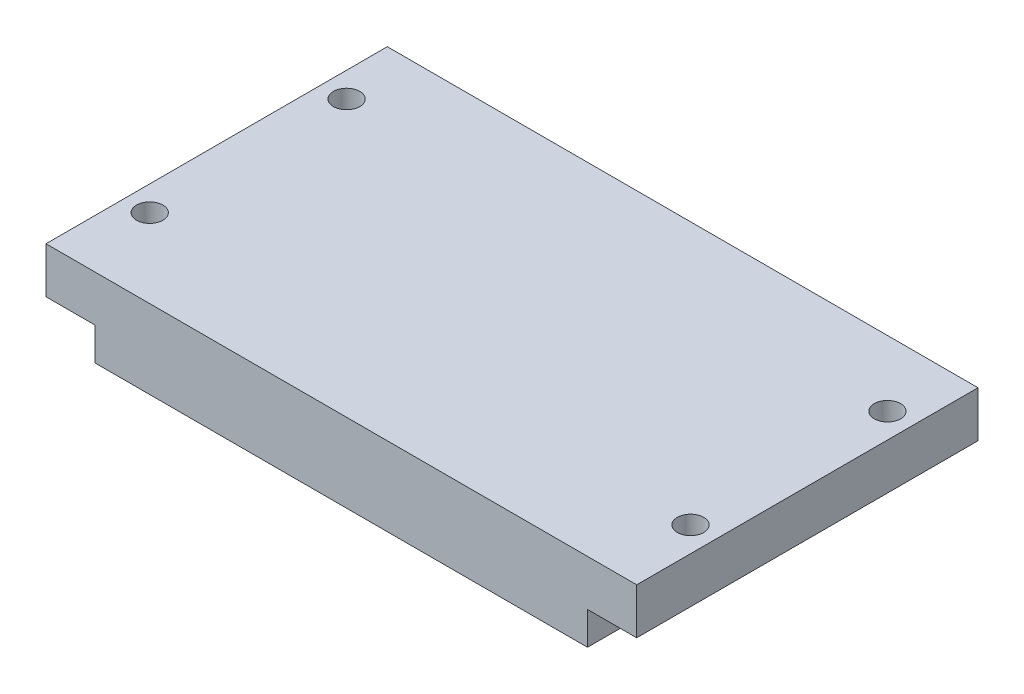
ISO-10303-21;
HEADER;
FILE_DESCRIPTION(('STEP AP214'),'2;1');
FILE_NAME('part.step','',(''),(''),'','','');
FILE_SCHEMA(('AUTOMOTIVE_DESIGN { 1 0 10303 214 1 1 1 1 }'));
ENDSEC;
DATA;
#1=APPLICATION_CONTEXT('core data for automotive mechanical design processes');
#2=APPLICATION_PROTOCOL_DEFINITION('international standard','automotive_design',2000,#1);
#3=PRODUCT_CONTEXT('',#1,'mechanical');
#4=PRODUCT('Part','Part','',(#3));
#5=PRODUCT_RELATED_PRODUCT_CATEGORY('part','',(#4));
#6=PRODUCT_DEFINITION_FORMATION('','',#4);
#7=PRODUCT_DEFINITION_CONTEXT('part definition',#1,'design');
#8=PRODUCT_DEFINITION('design','',#6,#7);
#9=PRODUCT_DEFINITION_SHAPE('','',#8);
#10=(LENGTH_UNIT() NAMED_UNIT(*) SI_UNIT(.MILLI.,.METRE.));
#11=(NAMED_UNIT(*) PLANE_ANGLE_UNIT() SI_UNIT($,.RADIAN.));
#12=(NAMED_UNIT(*) SI_UNIT($,.STERADIAN.) SOLID_ANGLE_UNIT());
#13=UNCERTAINTY_MEASURE_WITH_UNIT(LENGTH_MEASURE(1.E-05),#10,'distance_accuracy_value','');
#14=(GEOMETRIC_REPRESENTATION_CONTEXT(3) GLOBAL_UNCERTAINTY_ASSIGNED_CONTEXT((#13)) GLOBAL_UNIT_ASSIGNED_CONTEXT((#10,
#11,#12)) REPRESENTATION_CONTEXT('',''));
#15=CARTESIAN_POINT('',(0.,0.,0.));
#16=DIRECTION('',(0.,0.,1.));
#17=DIRECTION('',(1.,0.,0.));
#18=AXIS2_PLACEMENT_3D('',#15,#16,#17);
#19=CARTESIAN_POINT('',(0.,0.,66.04));
#20=DIRECTION('',(1.,0.,0.));
#21=DIRECTION('',(0.,1.,0.));
#22=AXIS2_PLACEMENT_3D('',#19,#20,#21);
#23=PLANE('',#22);
#24=DIRECTION('',(0.,-1.,0.));
#25=VECTOR('',#24,1.);
#26=CARTESIAN_POINT('',(0.,0.,0.));
#27=LINE('',#26,#25);
#28=CARTESIAN_POINT('',(0.,0.,0.));
#29=VERTEX_POINT('',#28);
#30=CARTESIAN_POINT('',(0.,-8.89,0.));
#31=VERTEX_POINT('',#30);
#32=EDGE_CURVE('E128',#29,#31,#27,.T.);
#33=ORIENTED_EDGE('',*,*,#32,.T.);
#34=DIRECTION('',(0.,0.,-1.));
#35=VECTOR('',#34,1.);
#36=CARTESIAN_POINT('',(0.,-8.89,66.04));
#37=LINE('',#36,#35);
#38=CARTESIAN_POINT('',(0.,-8.89,66.04));
#39=VERTEX_POINT('',#38);
#40=EDGE_CURVE('E11',#39,#31,#37,.T.);
#41=ORIENTED_EDGE('',*,*,#40,.F.);
#42=DIRECTION('',(0.,-1.,0.));
#43=VECTOR('',#42,1.);
#44=CARTESIAN_POINT('',(0.,0.,66.04));
#45=LINE('',#44,#43);
#46=CARTESIAN_POINT('',(0.,0.,66.04));
#47=VERTEX_POINT('',#46);
#48=EDGE_CURVE('E143',#47,#39,#45,.T.);
#49=ORIENTED_EDGE('',*,*,#48,.F.);
#50=DIRECTION('',(0.,0.,-1.));
#51=VECTOR('',#50,1.);
#52=CARTESIAN_POINT('',(0.,0.,66.04));
#53=LINE('',#52,#51);
#54=EDGE_CURVE('E124',#47,#29,#53,.T.);
#55=ORIENTED_EDGE('',*,*,#54,.T.);
#56=EDGE_LOOP('',(#33,#41,#49,#55));
#57=FACE_BOUND('',#56,.T.);
#58=ADVANCED_FACE('F32',(#57),#23,.F.);
#59=CARTESIAN_POINT('',(0.,-8.89,66.04));
#60=DIRECTION('',(0.,1.,0.));
#61=DIRECTION('',(0.,0.,1.));
#62=AXIS2_PLACEMENT_3D('',#59,#60,#61);
#63=PLANE('',#62);
#64=CARTESIAN_POINT('',(4.826,-8.89,12.7));
#65=DIRECTION('',(0.,1.,0.));
#66=DIRECTION('',(0.,0.,1.));
#67=AXIS2_PLACEMENT_3D('',#64,#65,#66);
#68=CIRCLE('',#67,2.55269999999999);
#69=CARTESIAN_POINT('',(4.826,-8.89,15.2527));
#70=VERTEX_POINT('',#69);
#71=EDGE_CURVE('E193',#70,#70,#68,.T.);
#72=ORIENTED_EDGE('',*,*,#71,.T.);
#73=EDGE_LOOP('',(#72));
#74=FACE_BOUND('',#73,.T.);
#75=CARTESIAN_POINT('',(4.826,-8.89,50.8));
#76=DIRECTION('',(0.,1.,0.));
#77=DIRECTION('',(0.,0.,1.));
#78=AXIS2_PLACEMENT_3D('',#75,#76,#77);
#79=CIRCLE('',#78,2.55269999999999);
#80=CARTESIAN_POINT('',(4.826,-8.89,53.3527));
#81=VERTEX_POINT('',#80);
#82=EDGE_CURVE('E187',#81,#81,#79,.T.);
#83=ORIENTED_EDGE('',*,*,#82,.T.);
#84=EDGE_LOOP('',(#83));
#85=FACE_BOUND('',#84,.T.);
#86=DIRECTION('',(1.,0.,0.));
#87=VECTOR('',#86,1.);
#88=CARTESIAN_POINT('',(0.,-8.89,0.));
#89=LINE('',#88,#87);
#90=CARTESIAN_POINT('',(9.525,-8.89,0.));
#91=VERTEX_POINT('',#90);
#92=EDGE_CURVE('E131',#31,#91,#89,.T.);
#93=ORIENTED_EDGE('',*,*,#92,.T.);
#94=DIRECTION('',(0.,0.,-1.));
#95=VECTOR('',#94,1.);
#96=CARTESIAN_POINT('',(9.525,-8.89,66.04));
#97=LINE('',#96,#95);
#98=CARTESIAN_POINT('',(9.525,-8.89,66.04));
#99=VERTEX_POINT('',#98);
#100=EDGE_CURVE('E40',#99,#91,#97,.T.);
#101=ORIENTED_EDGE('',*,*,#100,.F.);
#102=DIRECTION('',(1.,0.,0.));
#103=VECTOR('',#102,1.);
#104=CARTESIAN_POINT('',(0.,-8.89,66.04));
#105=LINE('',#104,#103);
#106=EDGE_CURVE('E91',#39,#99,#105,.T.);
#107=ORIENTED_EDGE('',*,*,#106,.F.);
#108=ORIENTED_EDGE('',*,*,#40,.T.);
#109=EDGE_LOOP('',(#93,#101,#107,#108));
#110=FACE_BOUND('',#109,.T.);
#111=ADVANCED_FACE('F230',(#74,#85,#110),#63,.F.);
#112=CARTESIAN_POINT('',(9.525,-8.89,66.04));
#113=DIRECTION('',(1.,0.,0.));
#114=DIRECTION('',(0.,0.,-1.));
#115=AXIS2_PLACEMENT_3D('',#112,#113,#114);
#116=PLANE('',#115);
#117=DIRECTION('',(0.,-1.,0.));
#118=VECTOR('',#117,1.);
#119=CARTESIAN_POINT('',(9.525,-8.89,0.));
#120=LINE('',#119,#118);
#121=CARTESIAN_POINT('',(9.525,-15.24,0.));
#122=VERTEX_POINT('',#121);
#123=EDGE_CURVE('E134',#91,#122,#120,.T.);
#124=ORIENTED_EDGE('',*,*,#123,.T.);
#125=DIRECTION('',(0.,0.,-1.));
#126=VECTOR('',#125,1.);
#127=CARTESIAN_POINT('',(9.525,-15.24,66.04));
#128=LINE('',#127,#126);
#129=CARTESIAN_POINT('',(9.525,-15.24,66.04));
#130=VERTEX_POINT('',#129);
#131=EDGE_CURVE('E150',#130,#122,#128,.T.);
#132=ORIENTED_EDGE('',*,*,#131,.F.);
#133=DIRECTION('',(0.,-1.,0.));
#134=VECTOR('',#133,1.);
#135=CARTESIAN_POINT('',(9.525,-8.89,66.04));
#136=LINE('',#135,#134);
#137=EDGE_CURVE('E158',#99,#130,#136,.T.);
#138=ORIENTED_EDGE('',*,*,#137,.F.);
#139=ORIENTED_EDGE('',*,*,#100,.T.);
#140=EDGE_LOOP('',(#124,#132,#138,#139));
#141=FACE_BOUND('',#140,.T.);
#142=ADVANCED_FACE('F156',(#141),#116,.F.);
#143=CARTESIAN_POINT('',(9.525,-15.24,66.04));
#144=DIRECTION('',(0.,1.,0.));
#145=DIRECTION('',(0.,0.,1.));
#146=AXIS2_PLACEMENT_3D('',#143,#144,#145);
#147=PLANE('',#146);
#148=DIRECTION('',(1.,0.,0.));
#149=VECTOR('',#148,1.);
#150=CARTESIAN_POINT('',(9.525,-15.24,0.));
#151=LINE('',#150,#149);
#152=CARTESIAN_POINT('',(104.775,-15.24,0.));
#153=VERTEX_POINT('',#152);
#154=EDGE_CURVE('E136',#122,#153,#151,.T.);
#155=ORIENTED_EDGE('',*,*,#154,.T.);
#156=DIRECTION('',(0.,0.,-1.));
#157=VECTOR('',#156,1.);
#158=CARTESIAN_POINT('',(104.775,-15.24,66.04));
#159=LINE('',#158,#157);
#160=CARTESIAN_POINT('',(104.775,-15.24,66.04));
#161=VERTEX_POINT('',#160);
#162=EDGE_CURVE('E147',#161,#153,#159,.T.);
#163=ORIENTED_EDGE('',*,*,#162,.F.);
#164=DIRECTION('',(1.,0.,0.));
#165=VECTOR('',#164,1.);
#166=CARTESIAN_POINT('',(9.525,-15.24,66.04));
#167=LINE('',#166,#165);
#168=EDGE_CURVE('E170',#130,#161,#167,.T.);
#169=ORIENTED_EDGE('',*,*,#168,.F.);
#170=ORIENTED_EDGE('',*,*,#131,.T.);
#171=EDGE_LOOP('',(#155,#163,#169,#170));
#172=FACE_BOUND('',#171,.T.);
#173=ADVANCED_FACE('F166',(#172),#147,.F.);
#174=CARTESIAN_POINT('',(104.775,-8.89,66.04));
#175=DIRECTION('',(-1.,0.,0.));
#176=DIRECTION('',(0.,0.,1.));
#177=AXIS2_PLACEMENT_3D('',#174,#175,#176);
#178=PLANE('',#177);
#179=DIRECTION('',(0.,1.,0.));
#180=VECTOR('',#179,1.);
#181=CARTESIAN_POINT('',(104.775,-8.89,0.));
#182=LINE('',#181,#180);
#183=CARTESIAN_POINT('',(104.775,-8.89,0.));
#184=VERTEX_POINT('',#183);
#185=EDGE_CURVE('E138',#153,#184,#182,.T.);
#186=ORIENTED_EDGE('',*,*,#185,.T.);
#187=DIRECTION('',(0.,0.,-1.));
#188=VECTOR('',#187,1.);
#189=CARTESIAN_POINT('',(104.775,-8.89,66.04));
#190=LINE('',#189,#188);
#191=CARTESIAN_POINT('',(104.775,-8.89,66.04));
#192=VERTEX_POINT('',#191);
#193=EDGE_CURVE('E119',#192,#184,#190,.T.);
#194=ORIENTED_EDGE('',*,*,#193,.F.);
#195=DIRECTION('',(0.,1.,0.));
#196=VECTOR('',#195,1.);
#197=CARTESIAN_POINT('',(104.775,-8.89,66.04));
#198=LINE('',#197,#196);
#199=EDGE_CURVE('E110',#161,#192,#198,.T.);
#200=ORIENTED_EDGE('',*,*,#199,.F.);
#201=ORIENTED_EDGE('',*,*,#162,.T.);
#202=EDGE_LOOP('',(#186,#194,#200,#201));
#203=FACE_BOUND('',#202,.T.);
#204=ADVANCED_FACE('F169',(#203),#178,.F.);
#205=CARTESIAN_POINT('',(114.3,-8.89,66.04));
#206=DIRECTION('',(0.,1.,0.));
#207=DIRECTION('',(-1.,0.,0.));
#208=AXIS2_PLACEMENT_3D('',#205,#206,#207);
#209=PLANE('',#208);
#210=CARTESIAN_POINT('',(109.474,-8.89,50.8));
#211=DIRECTION('',(0.,1.,0.));
#212=DIRECTION('',(-1.,0.,0.));
#213=AXIS2_PLACEMENT_3D('',#210,#211,#212);
#214=CIRCLE('',#213,2.55269999999999);
#215=CARTESIAN_POINT('',(106.9213,-8.89,50.8));
#216=VERTEX_POINT('',#215);
#217=EDGE_CURVE('E181',#216,#216,#214,.T.);
#218=ORIENTED_EDGE('',*,*,#217,.T.);
#219=EDGE_LOOP('',(#218));
#220=FACE_BOUND('',#219,.T.);
#221=CARTESIAN_POINT('',(109.474,-8.89,12.7));
#222=DIRECTION('',(0.,1.,0.));
#223=DIRECTION('',(-1.,0.,0.));
#224=AXIS2_PLACEMENT_3D('',#221,#222,#223);
#225=CIRCLE('',#224,2.55269999999999);
#226=CARTESIAN_POINT('',(106.9213,-8.89,12.7));
#227=VERTEX_POINT('',#226);
#228=EDGE_CURVE('E132',#227,#227,#225,.T.);
#229=ORIENTED_EDGE('',*,*,#228,.T.);
#230=EDGE_LOOP('',(#229));
#231=FACE_BOUND('',#230,.T.);
#232=DIRECTION('',(1.,0.,0.));
#233=VECTOR('',#232,1.);
#234=CARTESIAN_POINT('',(114.3,-8.89,0.));
#235=LINE('',#234,#233);
#236=CARTESIAN_POINT('',(114.3,-8.89,0.));
#237=VERTEX_POINT('',#236);
#238=EDGE_CURVE('E118',#184,#237,#235,.T.);
#239=ORIENTED_EDGE('',*,*,#238,.T.);
#240=DIRECTION('',(0.,0.,-1.));
#241=VECTOR('',#240,1.);
#242=CARTESIAN_POINT('',(114.3,-8.89,66.04));
#243=LINE('',#242,#241);
#244=CARTESIAN_POINT('',(114.3,-8.89,66.04));
#245=VERTEX_POINT('',#244);
#246=EDGE_CURVE('E115',#245,#237,#243,.T.);
#247=ORIENTED_EDGE('',*,*,#246,.F.);
#248=DIRECTION('',(1.,0.,0.));
#249=VECTOR('',#248,1.);
#250=CARTESIAN_POINT('',(114.3,-8.89,66.04));
#251=LINE('',#250,#249);
#252=EDGE_CURVE('E104',#192,#245,#251,.T.);
#253=ORIENTED_EDGE('',*,*,#252,.F.);
#254=ORIENTED_EDGE('',*,*,#193,.T.);
#255=EDGE_LOOP('',(#239,#247,#253,#254));
#256=FACE_BOUND('',#255,.T.);
#257=ADVANCED_FACE('F116',(#220,#231,#256),#209,.F.);
#258=CARTESIAN_POINT('',(114.3,0.,66.04));
#259=DIRECTION('',(-1.,0.,0.));
#260=DIRECTION('',(0.,0.,1.));
#261=AXIS2_PLACEMENT_3D('',#258,#259,#260);
#262=PLANE('',#261);
#263=DIRECTION('',(0.,1.,0.));
#264=VECTOR('',#263,1.);
#265=CARTESIAN_POINT('',(114.3,0.,0.));
#266=LINE('',#265,#264);
#267=CARTESIAN_POINT('',(114.3,0.,0.));
#268=VERTEX_POINT('',#267);
#269=EDGE_CURVE('E77',#237,#268,#266,.T.);
#270=ORIENTED_EDGE('',*,*,#269,.T.);
#271=DIRECTION('',(0.,0.,-1.));
#272=VECTOR('',#271,1.);
#273=CARTESIAN_POINT('',(114.3,0.,66.04));
#274=LINE('',#273,#272);
#275=CARTESIAN_POINT('',(114.3,0.,66.04));
#276=VERTEX_POINT('',#275);
#277=EDGE_CURVE('E120',#276,#268,#274,.T.);
#278=ORIENTED_EDGE('',*,*,#277,.F.);
#279=DIRECTION('',(0.,1.,0.));
#280=VECTOR('',#279,1.);
#281=CARTESIAN_POINT('',(114.3,0.,66.04));
#282=LINE('',#281,#280);
#283=EDGE_CURVE('E108',#245,#276,#282,.T.);
#284=ORIENTED_EDGE('',*,*,#283,.F.);
#285=ORIENTED_EDGE('',*,*,#246,.T.);
#286=EDGE_LOOP('',(#270,#278,#284,#285));
#287=FACE_BOUND('',#286,.T.);
#288=ADVANCED_FACE('F122',(#287),#262,.F.);
#289=CARTESIAN_POINT('',(0.,0.,66.04));
#290=DIRECTION('',(0.,-1.,0.));
#291=DIRECTION('',(0.,0.,-1.));
#292=AXIS2_PLACEMENT_3D('',#289,#290,#291);
#293=PLANE('',#292);
#294=CARTESIAN_POINT('',(4.826,0.,12.7));
#295=DIRECTION('',(0.,1.,0.));
#296=DIRECTION('',(0.,0.,1.));
#297=AXIS2_PLACEMENT_3D('',#294,#295,#296);
#298=CIRCLE('',#297,2.55269999999999);
#299=CARTESIAN_POINT('',(4.826,0.,15.2527));
#300=VERTEX_POINT('',#299);
#301=EDGE_CURVE('E196',#300,#300,#298,.T.);
#302=ORIENTED_EDGE('',*,*,#301,.F.);
#303=EDGE_LOOP('',(#302));
#304=FACE_BOUND('',#303,.T.);
#305=CARTESIAN_POINT('',(4.826,0.,50.8));
#306=DIRECTION('',(0.,1.,0.));
#307=DIRECTION('',(0.,0.,1.));
#308=AXIS2_PLACEMENT_3D('',#305,#306,#307);
#309=CIRCLE('',#308,2.55269999999999);
#310=CARTESIAN_POINT('',(4.826,0.,53.3527));
#311=VERTEX_POINT('',#310);
#312=EDGE_CURVE('E190',#311,#311,#309,.T.);
#313=ORIENTED_EDGE('',*,*,#312,.F.);
#314=EDGE_LOOP('',(#313));
#315=FACE_BOUND('',#314,.T.);
#316=CARTESIAN_POINT('',(109.474,0.,50.8));
#317=DIRECTION('',(0.,1.,0.));
#318=DIRECTION('',(0.,0.,1.));
#319=AXIS2_PLACEMENT_3D('',#316,#317,#318);
#320=CIRCLE('',#319,2.55269999999999);
#321=CARTESIAN_POINT('',(109.474,0.,53.3527));
#322=VERTEX_POINT('',#321);
#323=EDGE_CURVE('E184',#322,#322,#320,.T.);
#324=ORIENTED_EDGE('',*,*,#323,.F.);
#325=EDGE_LOOP('',(#324));
#326=FACE_BOUND('',#325,.T.);
#327=CARTESIAN_POINT('',(109.474,0.,12.7));
#328=DIRECTION('',(0.,1.,0.));
#329=DIRECTION('',(0.,0.,1.));
#330=AXIS2_PLACEMENT_3D('',#327,#328,#329);
#331=CIRCLE('',#330,2.55269999999999);
#332=CARTESIAN_POINT('',(109.474,0.,15.2527));
#333=VERTEX_POINT('',#332);
#334=EDGE_CURVE('E178',#333,#333,#331,.T.);
#335=ORIENTED_EDGE('',*,*,#334,.F.);
#336=EDGE_LOOP('',(#335));
#337=FACE_BOUND('',#336,.T.);
#338=DIRECTION('',(-1.,0.,0.));
#339=VECTOR('',#338,1.);
#340=CARTESIAN_POINT('',(0.,0.,0.));
#341=LINE('',#340,#339);
#342=EDGE_CURVE('E83',#268,#29,#341,.T.);
#343=ORIENTED_EDGE('',*,*,#342,.T.);
#344=ORIENTED_EDGE('',*,*,#54,.F.);
#345=DIRECTION('',(-1.,0.,0.));
#346=VECTOR('',#345,1.);
#347=CARTESIAN_POINT('',(0.,0.,66.04));
#348=LINE('',#347,#346);
#349=EDGE_CURVE('E48',#276,#47,#348,.T.);
#350=ORIENTED_EDGE('',*,*,#349,.F.);
#351=ORIENTED_EDGE('',*,*,#277,.T.);
#352=EDGE_LOOP('',(#343,#344,#350,#351));
#353=FACE_BOUND('',#352,.T.);
#354=ADVANCED_FACE('F203',(#304,#315,#326,#337,#353),#293,.F.);
#355=CARTESIAN_POINT('',(0.,-8.89,66.04));
#356=DIRECTION('',(0.,0.,1.));
#357=DIRECTION('',(1.,0.,0.));
#358=AXIS2_PLACEMENT_3D('',#355,#356,#357);
#359=PLANE('',#358);
#360=ORIENTED_EDGE('',*,*,#48,.T.);
#361=ORIENTED_EDGE('',*,*,#106,.T.);
#362=ORIENTED_EDGE('',*,*,#137,.T.);
#363=ORIENTED_EDGE('',*,*,#168,.T.);
#364=ORIENTED_EDGE('',*,*,#199,.T.);
#365=ORIENTED_EDGE('',*,*,#252,.T.);
#366=ORIENTED_EDGE('',*,*,#283,.T.);
#367=ORIENTED_EDGE('',*,*,#349,.T.);
#368=EDGE_LOOP('',(#360,#361,#362,#363,#364,#365,#366,#367));
#369=FACE_BOUND('',#368,.T.);
#370=ADVANCED_FACE('F106',(#369),#359,.T.);
#371=CARTESIAN_POINT('',(0.,-8.89,0.));
#372=DIRECTION('',(0.,0.,1.));
#373=DIRECTION('',(1.,0.,0.));
#374=AXIS2_PLACEMENT_3D('',#371,#372,#373);
#375=PLANE('',#374);
#376=ORIENTED_EDGE('',*,*,#32,.F.);
#377=ORIENTED_EDGE('',*,*,#342,.F.);
#378=ORIENTED_EDGE('',*,*,#269,.F.);
#379=ORIENTED_EDGE('',*,*,#238,.F.);
#380=ORIENTED_EDGE('',*,*,#185,.F.);
#381=ORIENTED_EDGE('',*,*,#154,.F.);
#382=ORIENTED_EDGE('',*,*,#123,.F.);
#383=ORIENTED_EDGE('',*,*,#92,.F.);
#384=EDGE_LOOP('',(#376,#377,#378,#379,#380,#381,#382,#383));
#385=FACE_BOUND('',#384,.T.);
#386=ADVANCED_FACE('F162',(#385),#375,.F.);
#387=CARTESIAN_POINT('',(109.474,0.,12.7));
#388=DIRECTION('',(0.,1.,0.));
#389=DIRECTION('',(0.,0.,1.));
#390=AXIS2_PLACEMENT_3D('',#387,#388,#389);
#391=CYLINDRICAL_SURFACE('',#390,2.55269999999999);
#392=ORIENTED_EDGE('',*,*,#334,.T.);
#393=EDGE_LOOP('',(#392));
#394=FACE_BOUND('',#393,.T.);
#395=ORIENTED_EDGE('',*,*,#228,.F.);
#396=EDGE_LOOP('',(#395));
#397=FACE_BOUND('',#396,.T.);
#398=ADVANCED_FACE('F213',(#394,#397),#391,.F.);
#399=CARTESIAN_POINT('',(109.474,0.,50.8));
#400=DIRECTION('',(0.,1.,0.));
#401=DIRECTION('',(0.,0.,1.));
#402=AXIS2_PLACEMENT_3D('',#399,#400,#401);
#403=CYLINDRICAL_SURFACE('',#402,2.55269999999999);
#404=ORIENTED_EDGE('',*,*,#323,.T.);
#405=EDGE_LOOP('',(#404));
#406=FACE_BOUND('',#405,.T.);
#407=ORIENTED_EDGE('',*,*,#217,.F.);
#408=EDGE_LOOP('',(#407));
#409=FACE_BOUND('',#408,.T.);
#410=ADVANCED_FACE('F216',(#406,#409),#403,.F.);
#411=CARTESIAN_POINT('',(4.826,0.,50.8));
#412=DIRECTION('',(0.,1.,0.));
#413=DIRECTION('',(0.,0.,1.));
#414=AXIS2_PLACEMENT_3D('',#411,#412,#413);
#415=CYLINDRICAL_SURFACE('',#414,2.55269999999999);
#416=ORIENTED_EDGE('',*,*,#312,.T.);
#417=EDGE_LOOP('',(#416));
#418=FACE_BOUND('',#417,.T.);
#419=ORIENTED_EDGE('',*,*,#82,.F.);
#420=EDGE_LOOP('',(#419));
#421=FACE_BOUND('',#420,.T.);
#422=ADVANCED_FACE('F306',(#418,#421),#415,.F.);
#423=CARTESIAN_POINT('',(4.826,0.,12.7));
#424=DIRECTION('',(0.,1.,0.));
#425=DIRECTION('',(0.,0.,1.));
#426=AXIS2_PLACEMENT_3D('',#423,#424,#425);
#427=CYLINDRICAL_SURFACE('',#426,2.55269999999999);
#428=ORIENTED_EDGE('',*,*,#301,.T.);
#429=EDGE_LOOP('',(#428));
#430=FACE_BOUND('',#429,.T.);
#431=ORIENTED_EDGE('',*,*,#71,.F.);
#432=EDGE_LOOP('',(#431));
#433=FACE_BOUND('',#432,.T.);
#434=ADVANCED_FACE('F200',(#430,#433),#427,.F.);
#435=CLOSED_SHELL('',(#58,#111,#142,#173,#204,#257,#288,#354,#370,#386,#398,#410,#422,#434));
#436=MANIFOLD_SOLID_BREP('B2',#435);
#437=ADVANCED_BREP_SHAPE_REPRESENTATION('',(#18,#436),#14);
#438=SHAPE_DEFINITION_REPRESENTATION(#9,#437);
ENDSEC;
END-ISO-10303-21;
